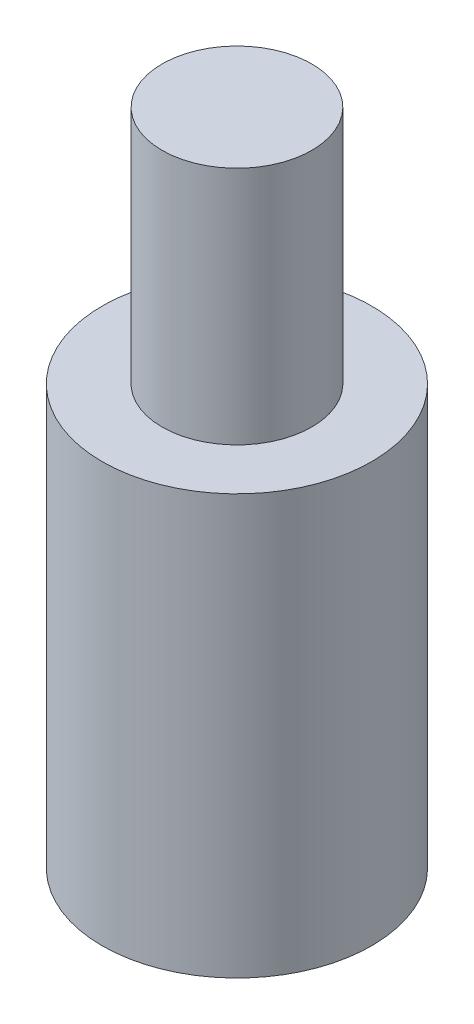
ISO-10303-21;
HEADER;
FILE_DESCRIPTION(('STEP AP214'),'2;1');
FILE_NAME('part.step','',(''),(''),'','','');
FILE_SCHEMA(('AUTOMOTIVE_DESIGN { 1 0 10303 214 1 1 1 1 }'));
ENDSEC;
DATA;
#1=APPLICATION_CONTEXT('core data for automotive mechanical design processes');
#2=APPLICATION_PROTOCOL_DEFINITION('international standard','automotive_design',2000,#1);
#3=PRODUCT_CONTEXT('',#1,'mechanical');
#4=PRODUCT('Part','Part','',(#3));
#5=PRODUCT_RELATED_PRODUCT_CATEGORY('part','',(#4));
#6=PRODUCT_DEFINITION_FORMATION('','',#4);
#7=PRODUCT_DEFINITION_CONTEXT('part definition',#1,'design');
#8=PRODUCT_DEFINITION('design','',#6,#7);
#9=PRODUCT_DEFINITION_SHAPE('','',#8);
#10=(LENGTH_UNIT() NAMED_UNIT(*) SI_UNIT(.MILLI.,.METRE.));
#11=(NAMED_UNIT(*) PLANE_ANGLE_UNIT() SI_UNIT($,.RADIAN.));
#12=(NAMED_UNIT(*) SI_UNIT($,.STERADIAN.) SOLID_ANGLE_UNIT());
#13=UNCERTAINTY_MEASURE_WITH_UNIT(LENGTH_MEASURE(1.E-05),#10,'distance_accuracy_value','');
#14=(GEOMETRIC_REPRESENTATION_CONTEXT(3) GLOBAL_UNCERTAINTY_ASSIGNED_CONTEXT((#13)) GLOBAL_UNIT_ASSIGNED_CONTEXT((#10,
#11,#12)) REPRESENTATION_CONTEXT('',''));
#15=CARTESIAN_POINT('',(0.,0.,0.));
#16=DIRECTION('',(0.,0.,1.));
#17=DIRECTION('',(1.,0.,0.));
#18=AXIS2_PLACEMENT_3D('',#15,#16,#17);
#19=CARTESIAN_POINT('',(0.,11.,0.));
#20=DIRECTION('',(0.,-1.,0.));
#21=DIRECTION('',(0.,0.,-1.));
#22=AXIS2_PLACEMENT_3D('',#19,#20,#21);
#23=CYLINDRICAL_SURFACE('',#22,1.25);
#24=CARTESIAN_POINT('',(0.,11.,0.));
#25=DIRECTION('',(0.,1.,0.));
#26=DIRECTION('',(0.,0.,1.));
#27=AXIS2_PLACEMENT_3D('',#24,#25,#26);
#28=CIRCLE('',#27,1.25);
#29=CARTESIAN_POINT('',(0.,11.,1.25));
#30=VERTEX_POINT('',#29);
#31=EDGE_CURVE('E11',#30,#30,#28,.T.);
#32=ORIENTED_EDGE('',*,*,#31,.F.);
#33=EDGE_LOOP('',(#32));
#34=FACE_BOUND('',#33,.T.);
#35=CARTESIAN_POINT('',(0.,7.,0.));
#36=DIRECTION('',(0.,1.,0.));
#37=DIRECTION('',(0.,0.,1.));
#38=AXIS2_PLACEMENT_3D('',#35,#36,#37);
#39=CIRCLE('',#38,1.25);
#40=CARTESIAN_POINT('',(0.,7.,1.25));
#41=VERTEX_POINT('',#40);
#42=EDGE_CURVE('E47',#41,#41,#39,.T.);
#43=ORIENTED_EDGE('',*,*,#42,.T.);
#44=EDGE_LOOP('',(#43));
#45=FACE_BOUND('',#44,.T.);
#46=ADVANCED_FACE('F44',(#34,#45),#23,.T.);
#47=CARTESIAN_POINT('',(0.,11.,0.));
#48=DIRECTION('',(0.,1.,0.));
#49=DIRECTION('',(0.,0.,1.));
#50=AXIS2_PLACEMENT_3D('',#47,#48,#49);
#51=PLANE('',#50);
#52=ORIENTED_EDGE('',*,*,#31,.T.);
#53=EDGE_LOOP('',(#52));
#54=FACE_BOUND('',#53,.T.);
#55=ADVANCED_FACE('F59',(#54),#51,.T.);
#56=CARTESIAN_POINT('',(0.,7.,0.));
#57=DIRECTION('',(0.,1.,0.));
#58=DIRECTION('',(0.,0.,1.));
#59=AXIS2_PLACEMENT_3D('',#56,#57,#58);
#60=PLANE('',#59);
#61=ORIENTED_EDGE('',*,*,#42,.F.);
#62=EDGE_LOOP('',(#61));
#63=FACE_BOUND('',#62,.T.);
#64=ADVANCED_FACE('F57',(#63),#60,.F.);
#65=CLOSED_SHELL('',(#46,#55,#64));
#66=MANIFOLD_SOLID_BREP('B2',#65);
#67=CARTESIAN_POINT('',(0.,7.,0.));
#68=DIRECTION('',(0.,1.,0.));
#69=DIRECTION('',(0.,0.,1.));
#70=AXIS2_PLACEMENT_3D('',#67,#68,#69);
#71=PLANE('',#70);
#72=CARTESIAN_POINT('',(0.,7.,0.));
#73=DIRECTION('',(0.,1.,0.));
#74=DIRECTION('',(0.,0.,1.));
#75=AXIS2_PLACEMENT_3D('',#72,#73,#74);
#76=CIRCLE('',#75,2.25);
#77=CARTESIAN_POINT('',(0.,7.,2.25));
#78=VERTEX_POINT('',#77);
#79=EDGE_CURVE('E43',#78,#78,#76,.T.);
#80=ORIENTED_EDGE('',*,*,#79,.T.);
#81=EDGE_LOOP('',(#80));
#82=FACE_BOUND('',#81,.T.);
#83=CARTESIAN_POINT('',(0.,7.,0.));
#84=DIRECTION('',(0.,1.,0.));
#85=DIRECTION('',(0.,0.,1.));
#86=AXIS2_PLACEMENT_3D('',#83,#84,#85);
#87=CIRCLE('',#86,1.25);
#88=CARTESIAN_POINT('',(0.,7.,1.25));
#89=VERTEX_POINT('',#88);
#90=EDGE_CURVE('E101',#89,#89,#87,.T.);
#91=ORIENTED_EDGE('',*,*,#90,.F.);
#92=EDGE_LOOP('',(#91));
#93=FACE_BOUND('',#92,.T.);
#94=ADVANCED_FACE('F90',(#82,#93),#71,.T.);
#95=CARTESIAN_POINT('',(0.,0.,0.));
#96=DIRECTION('',(0.,1.,0.));
#97=DIRECTION('',(0.,0.,1.));
#98=AXIS2_PLACEMENT_3D('',#95,#96,#97);
#99=PLANE('',#98);
#100=CARTESIAN_POINT('',(0.,0.,0.));
#101=DIRECTION('',(0.,1.,0.));
#102=DIRECTION('',(0.,0.,1.));
#103=AXIS2_PLACEMENT_3D('',#100,#101,#102);
#104=CIRCLE('',#103,2.25);
#105=CARTESIAN_POINT('',(0.,0.,2.25));
#106=VERTEX_POINT('',#105);
#107=EDGE_CURVE('E94',#106,#106,#104,.T.);
#108=ORIENTED_EDGE('',*,*,#107,.F.);
#109=EDGE_LOOP('',(#108));
#110=FACE_BOUND('',#109,.T.);
#111=CARTESIAN_POINT('',(0.,0.,0.));
#112=DIRECTION('',(0.,1.,0.));
#113=DIRECTION('',(0.,0.,1.));
#114=AXIS2_PLACEMENT_3D('',#111,#112,#113);
#115=CIRCLE('',#114,1.25);
#116=CARTESIAN_POINT('',(0.,0.,1.25));
#117=VERTEX_POINT('',#116);
#118=EDGE_CURVE('E103',#117,#117,#115,.T.);
#119=ORIENTED_EDGE('',*,*,#118,.T.);
#120=EDGE_LOOP('',(#119));
#121=FACE_BOUND('',#120,.T.);
#122=ADVANCED_FACE('F113',(#110,#121),#99,.F.);
#123=CARTESIAN_POINT('',(0.,7.,0.));
#124=DIRECTION('',(0.,-1.,0.));
#125=DIRECTION('',(0.,0.,-1.));
#126=AXIS2_PLACEMENT_3D('',#123,#124,#125);
#127=CYLINDRICAL_SURFACE('',#126,2.25);
#128=ORIENTED_EDGE('',*,*,#79,.F.);
#129=EDGE_LOOP('',(#128));
#130=FACE_BOUND('',#129,.T.);
#131=ORIENTED_EDGE('',*,*,#107,.T.);
#132=EDGE_LOOP('',(#131));
#133=FACE_BOUND('',#132,.T.);
#134=ADVANCED_FACE('F92',(#130,#133),#127,.T.);
#135=CARTESIAN_POINT('',(0.,7.,0.));
#136=DIRECTION('',(0.,-1.,0.));
#137=DIRECTION('',(0.,0.,-1.));
#138=AXIS2_PLACEMENT_3D('',#135,#136,#137);
#139=CYLINDRICAL_SURFACE('',#138,1.25);
#140=ORIENTED_EDGE('',*,*,#90,.T.);
#141=EDGE_LOOP('',(#140));
#142=FACE_BOUND('',#141,.T.);
#143=ORIENTED_EDGE('',*,*,#118,.F.);
#144=EDGE_LOOP('',(#143));
#145=FACE_BOUND('',#144,.T.);
#146=ADVANCED_FACE('F109',(#142,#145),#139,.F.);
#147=CLOSED_SHELL('',(#94,#122,#134,#146));
#148=MANIFOLD_SOLID_BREP('B6',#147);
#149=ADVANCED_BREP_SHAPE_REPRESENTATION('',(#18,#66,#148),#14);
#150=SHAPE_DEFINITION_REPRESENTATION(#9,#149);
ENDSEC;
END-ISO-10303-21;
